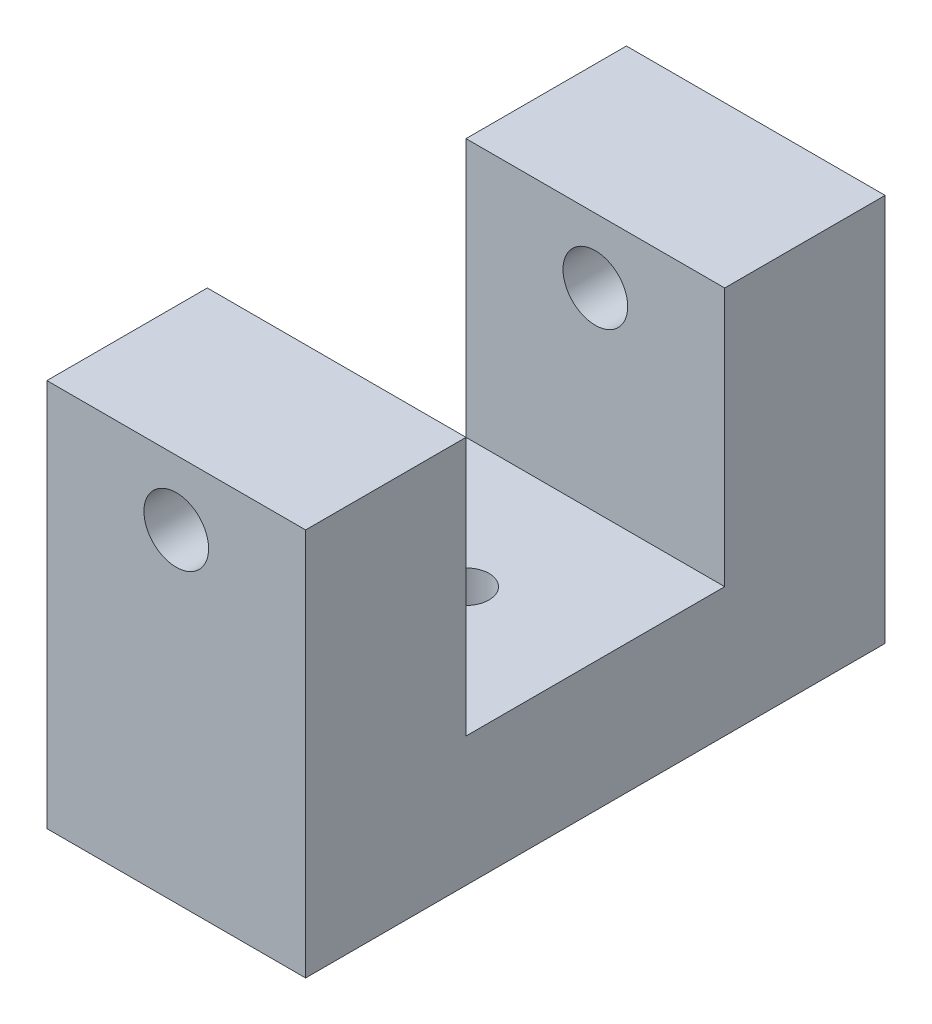
ISO-10303-21;
HEADER;
FILE_DESCRIPTION(('STEP AP214'),'2;1');
FILE_NAME('part.step','',(''),(''),'','','');
FILE_SCHEMA(('AUTOMOTIVE_DESIGN { 1 0 10303 214 1 1 1 1 }'));
ENDSEC;
DATA;
#1=APPLICATION_CONTEXT('core data for automotive mechanical design processes');
#2=APPLICATION_PROTOCOL_DEFINITION('international standard','automotive_design',2000,#1);
#3=PRODUCT_CONTEXT('',#1,'mechanical');
#4=PRODUCT('Part','Part','',(#3));
#5=PRODUCT_RELATED_PRODUCT_CATEGORY('part','',(#4));
#6=PRODUCT_DEFINITION_FORMATION('','',#4);
#7=PRODUCT_DEFINITION_CONTEXT('part definition',#1,'design');
#8=PRODUCT_DEFINITION('design','',#6,#7);
#9=PRODUCT_DEFINITION_SHAPE('','',#8);
#10=(LENGTH_UNIT() NAMED_UNIT(*) SI_UNIT(.MILLI.,.METRE.));
#11=(NAMED_UNIT(*) PLANE_ANGLE_UNIT() SI_UNIT($,.RADIAN.));
#12=(NAMED_UNIT(*) SI_UNIT($,.STERADIAN.) SOLID_ANGLE_UNIT());
#13=UNCERTAINTY_MEASURE_WITH_UNIT(LENGTH_MEASURE(1.E-05),#10,'distance_accuracy_value','');
#14=(GEOMETRIC_REPRESENTATION_CONTEXT(3) GLOBAL_UNCERTAINTY_ASSIGNED_CONTEXT((#13)) GLOBAL_UNIT_ASSIGNED_CONTEXT((#10,
#11,#12)) REPRESENTATION_CONTEXT('',''));
#15=CARTESIAN_POINT('',(0.,0.,0.));
#16=DIRECTION('',(0.,0.,1.));
#17=DIRECTION('',(1.,0.,0.));
#18=AXIS2_PLACEMENT_3D('',#15,#16,#17);
#19=CARTESIAN_POINT('',(0.,19.05,0.));
#20=DIRECTION('',(0.,-1.,0.));
#21=DIRECTION('',(0.,0.,-1.));
#22=AXIS2_PLACEMENT_3D('',#19,#20,#21);
#23=PLANE('',#22);
#24=DIRECTION('',(0.,0.,1.));
#25=VECTOR('',#24,1.);
#26=CARTESIAN_POINT('',(-6.35,19.05,14.224));
#27=LINE('',#26,#25);
#28=CARTESIAN_POINT('',(-6.35,19.05,-14.224));
#29=VERTEX_POINT('',#28);
#30=CARTESIAN_POINT('',(-6.35,19.05,-6.35));
#31=VERTEX_POINT('',#30);
#32=EDGE_CURVE('E126',#29,#31,#27,.T.);
#33=ORIENTED_EDGE('',*,*,#32,.T.);
#34=DIRECTION('',(1.,0.,0.));
#35=VECTOR('',#34,1.);
#36=CARTESIAN_POINT('',(-6.35,19.05,-6.35));
#37=LINE('',#36,#35);
#38=CARTESIAN_POINT('',(6.35,19.05,-6.35));
#39=VERTEX_POINT('',#38);
#40=EDGE_CURVE('E111',#31,#39,#37,.T.);
#41=ORIENTED_EDGE('',*,*,#40,.T.);
#42=DIRECTION('',(0.,0.,-1.));
#43=VECTOR('',#42,1.);
#44=CARTESIAN_POINT('',(6.35,19.05,14.224));
#45=LINE('',#44,#43);
#46=CARTESIAN_POINT('',(6.35,19.05,-14.224));
#47=VERTEX_POINT('',#46);
#48=EDGE_CURVE('E89',#39,#47,#45,.T.);
#49=ORIENTED_EDGE('',*,*,#48,.T.);
#50=DIRECTION('',(-1.,0.,0.));
#51=VECTOR('',#50,1.);
#52=CARTESIAN_POINT('',(-6.35,19.05,-14.224));
#53=LINE('',#52,#51);
#54=EDGE_CURVE('E130',#47,#29,#53,.T.);
#55=ORIENTED_EDGE('',*,*,#54,.T.);
#56=EDGE_LOOP('',(#33,#41,#49,#55));
#57=FACE_BOUND('',#56,.T.);
#58=ADVANCED_FACE('F35',(#57),#23,.F.);
#59=CARTESIAN_POINT('',(6.35,19.05,14.224));
#60=DIRECTION('',(-1.,0.,0.));
#61=DIRECTION('',(0.,0.,1.));
#62=AXIS2_PLACEMENT_3D('',#59,#60,#61);
#63=PLANE('',#62);
#64=ORIENTED_EDGE('',*,*,#48,.F.);
#65=DIRECTION('',(0.,1.,0.));
#66=VECTOR('',#65,1.);
#67=CARTESIAN_POINT('',(6.35,6.35,-6.35));
#68=LINE('',#67,#66);
#69=CARTESIAN_POINT('',(6.35,6.35,-6.35));
#70=VERTEX_POINT('',#69);
#71=EDGE_CURVE('E117',#70,#39,#68,.T.);
#72=ORIENTED_EDGE('',*,*,#71,.F.);
#73=DIRECTION('',(0.,0.,-1.));
#74=VECTOR('',#73,1.);
#75=CARTESIAN_POINT('',(6.35,6.35,6.35));
#76=LINE('',#75,#74);
#77=CARTESIAN_POINT('',(6.35,6.35,6.35));
#78=VERTEX_POINT('',#77);
#79=EDGE_CURVE('E128',#78,#70,#76,.T.);
#80=ORIENTED_EDGE('',*,*,#79,.F.);
#81=DIRECTION('',(0.,-1.,0.));
#82=VECTOR('',#81,1.);
#83=CARTESIAN_POINT('',(6.35,6.35,6.35));
#84=LINE('',#83,#82);
#85=CARTESIAN_POINT('',(6.35,19.05,6.35));
#86=VERTEX_POINT('',#85);
#87=EDGE_CURVE('E173',#86,#78,#84,.T.);
#88=ORIENTED_EDGE('',*,*,#87,.F.);
#89=CARTESIAN_POINT('',(6.35,19.05,14.224));
#90=VERTEX_POINT('',#89);
#91=EDGE_CURVE('E161',#90,#86,#45,.T.);
#92=ORIENTED_EDGE('',*,*,#91,.F.);
#93=DIRECTION('',(0.,-1.,0.));
#94=VECTOR('',#93,1.);
#95=CARTESIAN_POINT('',(6.35,19.05,14.224));
#96=LINE('',#95,#94);
#97=CARTESIAN_POINT('',(6.35,0.,14.224));
#98=VERTEX_POINT('',#97);
#99=EDGE_CURVE('E134',#90,#98,#96,.T.);
#100=ORIENTED_EDGE('',*,*,#99,.T.);
#101=DIRECTION('',(0.,0.,-1.));
#102=VECTOR('',#101,1.);
#103=CARTESIAN_POINT('',(6.35,0.,14.224));
#104=LINE('',#103,#102);
#105=CARTESIAN_POINT('',(6.35,0.,-14.224));
#106=VERTEX_POINT('',#105);
#107=EDGE_CURVE('E139',#98,#106,#104,.T.);
#108=ORIENTED_EDGE('',*,*,#107,.T.);
#109=DIRECTION('',(0.,-1.,0.));
#110=VECTOR('',#109,1.);
#111=CARTESIAN_POINT('',(6.35,19.05,-14.224));
#112=LINE('',#111,#110);
#113=EDGE_CURVE('E11',#47,#106,#112,.T.);
#114=ORIENTED_EDGE('',*,*,#113,.F.);
#115=EDGE_LOOP('',(#64,#72,#80,#88,#92,#100,#108,#114));
#116=FACE_BOUND('',#115,.T.);
#117=ADVANCED_FACE('F37',(#116),#63,.F.);
#118=CARTESIAN_POINT('',(-6.35,19.05,-14.224));
#119=DIRECTION('',(0.,0.,1.));
#120=DIRECTION('',(1.,0.,0.));
#121=AXIS2_PLACEMENT_3D('',#118,#119,#120);
#122=PLANE('',#121);
#123=CARTESIAN_POINT('',(0.,15.875,-14.224));
#124=DIRECTION('',(0.,0.,1.));
#125=DIRECTION('',(1.,0.,0.));
#126=AXIS2_PLACEMENT_3D('',#123,#124,#125);
#127=CIRCLE('',#126,1.5875);
#128=CARTESIAN_POINT('',(1.5875,15.875,-14.224));
#129=VERTEX_POINT('',#128);
#130=EDGE_CURVE('E184',#129,#129,#127,.T.);
#131=ORIENTED_EDGE('',*,*,#130,.T.);
#132=EDGE_LOOP('',(#131));
#133=FACE_BOUND('',#132,.T.);
#134=DIRECTION('',(-1.,0.,0.));
#135=VECTOR('',#134,1.);
#136=CARTESIAN_POINT('',(-6.35,0.,-14.224));
#137=LINE('',#136,#135);
#138=CARTESIAN_POINT('',(-6.35,0.,-14.224));
#139=VERTEX_POINT('',#138);
#140=EDGE_CURVE('E142',#106,#139,#137,.T.);
#141=ORIENTED_EDGE('',*,*,#140,.T.);
#142=DIRECTION('',(0.,-1.,0.));
#143=VECTOR('',#142,1.);
#144=CARTESIAN_POINT('',(-6.35,19.05,-14.224));
#145=LINE('',#144,#143);
#146=EDGE_CURVE('E44',#29,#139,#145,.T.);
#147=ORIENTED_EDGE('',*,*,#146,.F.);
#148=ORIENTED_EDGE('',*,*,#54,.F.);
#149=ORIENTED_EDGE('',*,*,#113,.T.);
#150=EDGE_LOOP('',(#141,#147,#148,#149));
#151=FACE_BOUND('',#150,.T.);
#152=ADVANCED_FACE('F211',(#133,#151),#122,.F.);
#153=CARTESIAN_POINT('',(-6.35,19.05,14.224));
#154=DIRECTION('',(1.,0.,0.));
#155=DIRECTION('',(0.,0.,-1.));
#156=AXIS2_PLACEMENT_3D('',#153,#154,#155);
#157=PLANE('',#156);
#158=DIRECTION('',(0.,0.,-1.));
#159=VECTOR('',#158,1.);
#160=CARTESIAN_POINT('',(-6.35,6.35,6.35));
#161=LINE('',#160,#159);
#162=CARTESIAN_POINT('',(-6.35,6.35,6.35));
#163=VERTEX_POINT('',#162);
#164=CARTESIAN_POINT('',(-6.35,6.35,-6.35));
#165=VERTEX_POINT('',#164);
#166=EDGE_CURVE('E120',#163,#165,#161,.T.);
#167=ORIENTED_EDGE('',*,*,#166,.T.);
#168=DIRECTION('',(0.,1.,0.));
#169=VECTOR('',#168,1.);
#170=CARTESIAN_POINT('',(-6.35,6.35,-6.35));
#171=LINE('',#170,#169);
#172=EDGE_CURVE('E114',#165,#31,#171,.T.);
#173=ORIENTED_EDGE('',*,*,#172,.T.);
#174=ORIENTED_EDGE('',*,*,#32,.F.);
#175=ORIENTED_EDGE('',*,*,#146,.T.);
#176=DIRECTION('',(0.,0.,1.));
#177=VECTOR('',#176,1.);
#178=CARTESIAN_POINT('',(-6.35,0.,14.224));
#179=LINE('',#178,#177);
#180=CARTESIAN_POINT('',(-6.35,0.,14.224));
#181=VERTEX_POINT('',#180);
#182=EDGE_CURVE('E145',#139,#181,#179,.T.);
#183=ORIENTED_EDGE('',*,*,#182,.T.);
#184=DIRECTION('',(0.,-1.,0.));
#185=VECTOR('',#184,1.);
#186=CARTESIAN_POINT('',(-6.35,19.05,14.224));
#187=LINE('',#186,#185);
#188=CARTESIAN_POINT('',(-6.35,19.05,14.224));
#189=VERTEX_POINT('',#188);
#190=EDGE_CURVE('E149',#189,#181,#187,.T.);
#191=ORIENTED_EDGE('',*,*,#190,.F.);
#192=CARTESIAN_POINT('',(-6.35,19.05,6.35));
#193=VERTEX_POINT('',#192);
#194=EDGE_CURVE('E132',#193,#189,#27,.T.);
#195=ORIENTED_EDGE('',*,*,#194,.F.);
#196=DIRECTION('',(0.,-1.,0.));
#197=VECTOR('',#196,1.);
#198=CARTESIAN_POINT('',(-6.35,6.35,6.35));
#199=LINE('',#198,#197);
#200=EDGE_CURVE('E51',#193,#163,#199,.T.);
#201=ORIENTED_EDGE('',*,*,#200,.T.);
#202=EDGE_LOOP('',(#167,#173,#174,#175,#183,#191,#195,#201));
#203=FACE_BOUND('',#202,.T.);
#204=ADVANCED_FACE('F124',(#203),#157,.F.);
#205=CARTESIAN_POINT('',(-6.35,19.05,14.224));
#206=DIRECTION('',(0.,0.,-1.));
#207=DIRECTION('',(-1.,0.,0.));
#208=AXIS2_PLACEMENT_3D('',#205,#206,#207);
#209=PLANE('',#208);
#210=CARTESIAN_POINT('',(0.,15.875,14.224));
#211=DIRECTION('',(0.,0.,1.));
#212=DIRECTION('',(1.,0.,0.));
#213=AXIS2_PLACEMENT_3D('',#210,#211,#212);
#214=CIRCLE('',#213,1.5875);
#215=CARTESIAN_POINT('',(1.5875,15.875,14.224));
#216=VERTEX_POINT('',#215);
#217=EDGE_CURVE('E181',#216,#216,#214,.T.);
#218=ORIENTED_EDGE('',*,*,#217,.F.);
#219=EDGE_LOOP('',(#218));
#220=FACE_BOUND('',#219,.T.);
#221=DIRECTION('',(1.,0.,0.));
#222=VECTOR('',#221,1.);
#223=CARTESIAN_POINT('',(-6.35,0.,14.224));
#224=LINE('',#223,#222);
#225=EDGE_CURVE('E81',#181,#98,#224,.T.);
#226=ORIENTED_EDGE('',*,*,#225,.T.);
#227=ORIENTED_EDGE('',*,*,#99,.F.);
#228=DIRECTION('',(1.,0.,0.));
#229=VECTOR('',#228,1.);
#230=CARTESIAN_POINT('',(-6.35,19.05,14.224));
#231=LINE('',#230,#229);
#232=EDGE_CURVE('E60',#189,#90,#231,.T.);
#233=ORIENTED_EDGE('',*,*,#232,.F.);
#234=ORIENTED_EDGE('',*,*,#190,.T.);
#235=EDGE_LOOP('',(#226,#227,#233,#234));
#236=FACE_BOUND('',#235,.T.);
#237=ADVANCED_FACE('F162',(#220,#236),#209,.F.);
#238=ORIENTED_EDGE('',*,*,#91,.T.);
#239=DIRECTION('',(1.,0.,0.));
#240=VECTOR('',#239,1.);
#241=CARTESIAN_POINT('',(-6.35,19.05,6.35));
#242=LINE('',#241,#240);
#243=EDGE_CURVE('E119',#193,#86,#242,.T.);
#244=ORIENTED_EDGE('',*,*,#243,.F.);
#245=ORIENTED_EDGE('',*,*,#194,.T.);
#246=ORIENTED_EDGE('',*,*,#232,.T.);
#247=EDGE_LOOP('',(#238,#244,#245,#246));
#248=FACE_BOUND('',#247,.T.);
#249=ADVANCED_FACE('F164',(#248),#23,.F.);
#250=CARTESIAN_POINT('',(0.,0.,0.));
#251=DIRECTION('',(0.,-1.,0.));
#252=DIRECTION('',(0.,0.,-1.));
#253=AXIS2_PLACEMENT_3D('',#250,#251,#252);
#254=PLANE('',#253);
#255=CARTESIAN_POINT('',(0.,0.,0.));
#256=DIRECTION('',(0.,-1.,0.));
#257=DIRECTION('',(0.,0.,-1.));
#258=AXIS2_PLACEMENT_3D('',#255,#256,#257);
#259=CIRCLE('',#258,1.13029999999999);
#260=CARTESIAN_POINT('',(0.,0.,-1.13029999999999));
#261=VERTEX_POINT('',#260);
#262=EDGE_CURVE('E190',#261,#261,#259,.T.);
#263=ORIENTED_EDGE('',*,*,#262,.F.);
#264=EDGE_LOOP('',(#263));
#265=FACE_BOUND('',#264,.T.);
#266=ORIENTED_EDGE('',*,*,#107,.F.);
#267=ORIENTED_EDGE('',*,*,#225,.F.);
#268=ORIENTED_EDGE('',*,*,#182,.F.);
#269=ORIENTED_EDGE('',*,*,#140,.F.);
#270=EDGE_LOOP('',(#266,#267,#268,#269));
#271=FACE_BOUND('',#270,.T.);
#272=ADVANCED_FACE('F156',(#265,#271),#254,.T.);
#273=CARTESIAN_POINT('',(-6.35,6.35,-6.35));
#274=DIRECTION('',(0.,0.,-1.));
#275=DIRECTION('',(-1.,0.,0.));
#276=AXIS2_PLACEMENT_3D('',#273,#274,#275);
#277=PLANE('',#276);
#278=CARTESIAN_POINT('',(0.,15.875,-6.35));
#279=DIRECTION('',(0.,0.,-1.));
#280=DIRECTION('',(-1.,0.,0.));
#281=AXIS2_PLACEMENT_3D('',#278,#279,#280);
#282=CIRCLE('',#281,1.5875);
#283=CARTESIAN_POINT('',(-1.5875,15.875,-6.35));
#284=VERTEX_POINT('',#283);
#285=EDGE_CURVE('E176',#284,#284,#282,.T.);
#286=ORIENTED_EDGE('',*,*,#285,.T.);
#287=EDGE_LOOP('',(#286));
#288=FACE_BOUND('',#287,.T.);
#289=ORIENTED_EDGE('',*,*,#71,.T.);
#290=ORIENTED_EDGE('',*,*,#40,.F.);
#291=ORIENTED_EDGE('',*,*,#172,.F.);
#292=DIRECTION('',(1.,0.,0.));
#293=VECTOR('',#292,1.);
#294=CARTESIAN_POINT('',(-6.35,6.35,-6.35));
#295=LINE('',#294,#293);
#296=EDGE_CURVE('E143',#165,#70,#295,.T.);
#297=ORIENTED_EDGE('',*,*,#296,.T.);
#298=EDGE_LOOP('',(#289,#290,#291,#297));
#299=FACE_BOUND('',#298,.T.);
#300=ADVANCED_FACE('F113',(#288,#299),#277,.F.);
#301=CARTESIAN_POINT('',(-6.35,6.35,6.35));
#302=DIRECTION('',(0.,-1.,0.));
#303=DIRECTION('',(0.,0.,-1.));
#304=AXIS2_PLACEMENT_3D('',#301,#302,#303);
#305=PLANE('',#304);
#306=CARTESIAN_POINT('',(0.,6.35,0.));
#307=DIRECTION('',(0.,-1.,0.));
#308=DIRECTION('',(0.,0.,-1.));
#309=AXIS2_PLACEMENT_3D('',#306,#307,#308);
#310=CIRCLE('',#309,1.13029999999999);
#311=CARTESIAN_POINT('',(0.,6.35,-1.13029999999999));
#312=VERTEX_POINT('',#311);
#313=EDGE_CURVE('E185',#312,#312,#310,.T.);
#314=ORIENTED_EDGE('',*,*,#313,.T.);
#315=EDGE_LOOP('',(#314));
#316=FACE_BOUND('',#315,.T.);
#317=ORIENTED_EDGE('',*,*,#79,.T.);
#318=ORIENTED_EDGE('',*,*,#296,.F.);
#319=ORIENTED_EDGE('',*,*,#166,.F.);
#320=DIRECTION('',(1.,0.,0.));
#321=VECTOR('',#320,1.);
#322=CARTESIAN_POINT('',(-6.35,6.35,6.35));
#323=LINE('',#322,#321);
#324=EDGE_CURVE('E166',#163,#78,#323,.T.);
#325=ORIENTED_EDGE('',*,*,#324,.T.);
#326=EDGE_LOOP('',(#317,#318,#319,#325));
#327=FACE_BOUND('',#326,.T.);
#328=ADVANCED_FACE('F202',(#316,#327),#305,.F.);
#329=CARTESIAN_POINT('',(-6.35,6.35,6.35));
#330=DIRECTION('',(0.,0.,1.));
#331=DIRECTION('',(1.,0.,0.));
#332=AXIS2_PLACEMENT_3D('',#329,#330,#331);
#333=PLANE('',#332);
#334=CARTESIAN_POINT('',(0.,15.875,6.35));
#335=DIRECTION('',(0.,0.,1.));
#336=DIRECTION('',(1.,0.,0.));
#337=AXIS2_PLACEMENT_3D('',#334,#335,#336);
#338=CIRCLE('',#337,1.5875);
#339=CARTESIAN_POINT('',(1.5875,15.875,6.35));
#340=VERTEX_POINT('',#339);
#341=EDGE_CURVE('E39',#340,#340,#338,.T.);
#342=ORIENTED_EDGE('',*,*,#341,.T.);
#343=EDGE_LOOP('',(#342));
#344=FACE_BOUND('',#343,.T.);
#345=ORIENTED_EDGE('',*,*,#87,.T.);
#346=ORIENTED_EDGE('',*,*,#324,.F.);
#347=ORIENTED_EDGE('',*,*,#200,.F.);
#348=ORIENTED_EDGE('',*,*,#243,.T.);
#349=EDGE_LOOP('',(#345,#346,#347,#348));
#350=FACE_BOUND('',#349,.T.);
#351=ADVANCED_FACE('F213',(#344,#350),#333,.F.);
#352=CARTESIAN_POINT('',(0.,15.875,-14.224));
#353=DIRECTION('',(0.,0.,1.));
#354=DIRECTION('',(1.,0.,0.));
#355=AXIS2_PLACEMENT_3D('',#352,#353,#354);
#356=CYLINDRICAL_SURFACE('',#355,1.5875);
#357=ORIENTED_EDGE('',*,*,#217,.T.);
#358=EDGE_LOOP('',(#357));
#359=FACE_BOUND('',#358,.T.);
#360=ORIENTED_EDGE('',*,*,#341,.F.);
#361=EDGE_LOOP('',(#360));
#362=FACE_BOUND('',#361,.T.);
#363=ADVANCED_FACE('F216',(#359,#362),#356,.F.);
#364=ORIENTED_EDGE('',*,*,#130,.F.);
#365=EDGE_LOOP('',(#364));
#366=FACE_BOUND('',#365,.T.);
#367=ORIENTED_EDGE('',*,*,#285,.F.);
#368=EDGE_LOOP('',(#367));
#369=FACE_BOUND('',#368,.T.);
#370=ADVANCED_FACE('F221',(#366,#369),#356,.F.);
#371=CARTESIAN_POINT('',(0.,0.,0.));
#372=DIRECTION('',(0.,-1.,0.));
#373=DIRECTION('',(0.,0.,-1.));
#374=AXIS2_PLACEMENT_3D('',#371,#372,#373);
#375=CYLINDRICAL_SURFACE('',#374,1.13029999999999);
#376=ORIENTED_EDGE('',*,*,#313,.F.);
#377=EDGE_LOOP('',(#376));
#378=FACE_BOUND('',#377,.T.);
#379=ORIENTED_EDGE('',*,*,#262,.T.);
#380=EDGE_LOOP('',(#379));
#381=FACE_BOUND('',#380,.T.);
#382=ADVANCED_FACE('F194',(#378,#381),#375,.F.);
#383=CLOSED_SHELL('',(#58,#117,#152,#204,#237,#249,#272,#300,#328,#351,#363,#370,#382));
#384=MANIFOLD_SOLID_BREP('B2',#383);
#385=ADVANCED_BREP_SHAPE_REPRESENTATION('',(#18,#384),#14);
#386=SHAPE_DEFINITION_REPRESENTATION(#9,#385);
ENDSEC;
END-ISO-10303-21;
